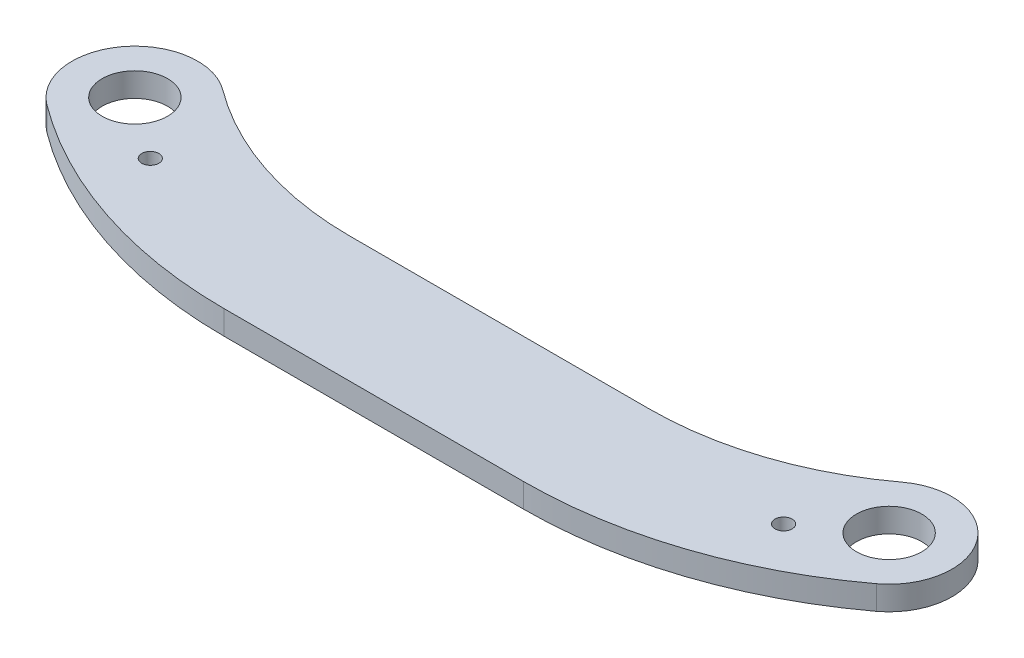
ISO-10303-21;
HEADER;
FILE_DESCRIPTION(('STEP AP214'),'2;1');
FILE_NAME('part.step','',(''),(''),'','','');
FILE_SCHEMA(('AUTOMOTIVE_DESIGN { 1 0 10303 214 1 1 1 1 }'));
ENDSEC;
DATA;
#1=APPLICATION_CONTEXT('core data for automotive mechanical design processes');
#2=APPLICATION_PROTOCOL_DEFINITION('international standard','automotive_design',2000,#1);
#3=PRODUCT_CONTEXT('',#1,'mechanical');
#4=PRODUCT('Part','Part','',(#3));
#5=PRODUCT_RELATED_PRODUCT_CATEGORY('part','',(#4));
#6=PRODUCT_DEFINITION_FORMATION('','',#4);
#7=PRODUCT_DEFINITION_CONTEXT('part definition',#1,'design');
#8=PRODUCT_DEFINITION('design','',#6,#7);
#9=PRODUCT_DEFINITION_SHAPE('','',#8);
#10=(LENGTH_UNIT() NAMED_UNIT(*) SI_UNIT(.MILLI.,.METRE.));
#11=(NAMED_UNIT(*) PLANE_ANGLE_UNIT() SI_UNIT($,.RADIAN.));
#12=(NAMED_UNIT(*) SI_UNIT($,.STERADIAN.) SOLID_ANGLE_UNIT());
#13=UNCERTAINTY_MEASURE_WITH_UNIT(LENGTH_MEASURE(1.E-05),#10,'distance_accuracy_value','');
#14=(GEOMETRIC_REPRESENTATION_CONTEXT(3) GLOBAL_UNCERTAINTY_ASSIGNED_CONTEXT((#13)) GLOBAL_UNIT_ASSIGNED_CONTEXT((#10,
#11,#12)) REPRESENTATION_CONTEXT('',''));
#15=CARTESIAN_POINT('',(0.,0.,0.));
#16=DIRECTION('',(0.,0.,1.));
#17=DIRECTION('',(1.,0.,0.));
#18=AXIS2_PLACEMENT_3D('',#15,#16,#17);
#19=CARTESIAN_POINT('',(-59.5,-9.53,-121.504166666667));
#20=DIRECTION('',(0.,1.,0.));
#21=DIRECTION('',(0.,0.,1.));
#22=AXIS2_PLACEMENT_3D('',#19,#20,#21);
#23=CYLINDRICAL_SURFACE('',#22,126.504166666667);
#24=CARTESIAN_POINT('',(-59.5,0.,-121.504166666667));
#25=DIRECTION('',(0.,-1.,0.));
#26=DIRECTION('',(0.,0.,-1.));
#27=AXIS2_PLACEMENT_3D('',#24,#25,#26);
#28=CIRCLE('',#27,126.504166666667);
#29=CARTESIAN_POINT('',(-59.5,0.,5.));
#30=VERTEX_POINT('',#29);
#31=CARTESIAN_POINT('',(-135.066417315255,0.,-20.0496410989797));
#32=VERTEX_POINT('',#31);
#33=EDGE_CURVE('E138',#30,#32,#28,.T.);
#34=ORIENTED_EDGE('',*,*,#33,.F.);
#35=DIRECTION('',(0.,1.,0.));
#36=VECTOR('',#35,1.);
#37=CARTESIAN_POINT('',(-59.5,-9.53,5.));
#38=LINE('',#37,#36);
#39=CARTESIAN_POINT('',(-59.5,-9.53,5.));
#40=VERTEX_POINT('',#39);
#41=EDGE_CURVE('E11',#40,#30,#38,.T.);
#42=ORIENTED_EDGE('',*,*,#41,.F.);
#43=CARTESIAN_POINT('',(-59.5,-9.53,-121.504166666667));
#44=DIRECTION('',(0.,-1.,0.));
#45=DIRECTION('',(0.,0.,-1.));
#46=AXIS2_PLACEMENT_3D('',#43,#44,#45);
#47=CIRCLE('',#46,126.504166666667);
#48=CARTESIAN_POINT('',(-135.066417315255,-9.53,-20.0496410989797));
#49=VERTEX_POINT('',#48);
#50=EDGE_CURVE('E159',#40,#49,#47,.T.);
#51=ORIENTED_EDGE('',*,*,#50,.T.);
#52=DIRECTION('',(0.,1.,0.));
#53=VECTOR('',#52,1.);
#54=CARTESIAN_POINT('',(-135.066417315255,-9.53,-20.0496410989797));
#55=LINE('',#54,#53);
#56=EDGE_CURVE('E44',#49,#32,#55,.T.);
#57=ORIENTED_EDGE('',*,*,#56,.T.);
#58=EDGE_LOOP('',(#34,#42,#51,#57));
#59=FACE_BOUND('',#58,.T.);
#60=ADVANCED_FACE('F41',(#59),#23,.F.);
#61=CARTESIAN_POINT('',(-59.5,-9.53,5.));
#62=DIRECTION('',(0.,0.,-1.));
#63=DIRECTION('',(-1.,0.,0.));
#64=AXIS2_PLACEMENT_3D('',#61,#62,#63);
#65=PLANE('',#64);
#66=DIRECTION('',(-1.,0.,0.));
#67=VECTOR('',#66,1.);
#68=CARTESIAN_POINT('',(-59.5,0.,5.));
#69=LINE('',#68,#67);
#70=CARTESIAN_POINT('',(59.5,0.,4.99999999999999));
#71=VERTEX_POINT('',#70);
#72=EDGE_CURVE('E157',#71,#30,#69,.T.);
#73=ORIENTED_EDGE('',*,*,#72,.F.);
#74=DIRECTION('',(0.,1.,0.));
#75=VECTOR('',#74,1.);
#76=CARTESIAN_POINT('',(59.5,-9.53,4.99999999999999));
#77=LINE('',#76,#75);
#78=CARTESIAN_POINT('',(59.5,-9.53,4.99999999999999));
#79=VERTEX_POINT('',#78);
#80=EDGE_CURVE('E50',#79,#71,#77,.T.);
#81=ORIENTED_EDGE('',*,*,#80,.F.);
#82=DIRECTION('',(-1.,0.,0.));
#83=VECTOR('',#82,1.);
#84=CARTESIAN_POINT('',(-59.5,-9.53,5.));
#85=LINE('',#84,#83);
#86=EDGE_CURVE('E128',#79,#40,#85,.T.);
#87=ORIENTED_EDGE('',*,*,#86,.T.);
#88=ORIENTED_EDGE('',*,*,#41,.T.);
#89=EDGE_LOOP('',(#73,#81,#87,#88));
#90=FACE_BOUND('',#89,.T.);
#91=ADVANCED_FACE('F171',(#90),#65,.T.);
#92=CARTESIAN_POINT('',(59.4999999999999,-9.53,-121.504166666667));
#93=DIRECTION('',(0.,1.,0.));
#94=DIRECTION('',(0.,0.,1.));
#95=AXIS2_PLACEMENT_3D('',#92,#93,#94);
#96=CYLINDRICAL_SURFACE('',#95,126.504166666667);
#97=CARTESIAN_POINT('',(59.4999999999999,0.,-121.504166666667));
#98=DIRECTION('',(0.,-1.,0.));
#99=DIRECTION('',(0.,0.,1.));
#100=AXIS2_PLACEMENT_3D('',#97,#98,#99);
#101=CIRCLE('',#100,126.504166666667);
#102=CARTESIAN_POINT('',(135.066417315255,0.,-20.0496410989797));
#103=VERTEX_POINT('',#102);
#104=EDGE_CURVE('E115',#103,#71,#101,.T.);
#105=ORIENTED_EDGE('',*,*,#104,.F.);
#106=DIRECTION('',(0.,1.,0.));
#107=VECTOR('',#106,1.);
#108=CARTESIAN_POINT('',(135.066417315255,-9.53,-20.0496410989797));
#109=LINE('',#108,#107);
#110=CARTESIAN_POINT('',(135.066417315255,-9.53,-20.0496410989797));
#111=VERTEX_POINT('',#110);
#112=EDGE_CURVE('E110',#111,#103,#109,.T.);
#113=ORIENTED_EDGE('',*,*,#112,.F.);
#114=CARTESIAN_POINT('',(59.4999999999999,-9.53,-121.504166666667));
#115=DIRECTION('',(0.,-1.,0.));
#116=DIRECTION('',(0.,0.,1.));
#117=AXIS2_PLACEMENT_3D('',#114,#115,#116);
#118=CIRCLE('',#117,126.504166666667);
#119=EDGE_CURVE('E113',#111,#79,#118,.T.);
#120=ORIENTED_EDGE('',*,*,#119,.T.);
#121=ORIENTED_EDGE('',*,*,#80,.T.);
#122=EDGE_LOOP('',(#105,#113,#120,#121));
#123=FACE_BOUND('',#122,.T.);
#124=ADVANCED_FACE('F112',(#123),#96,.F.);
#125=CARTESIAN_POINT('',(150.,-9.53,0.));
#126=DIRECTION('',(0.,1.,0.));
#127=DIRECTION('',(0.,0.,1.));
#128=AXIS2_PLACEMENT_3D('',#125,#126,#127);
#129=CYLINDRICAL_SURFACE('',#128,25.);
#130=CARTESIAN_POINT('',(150.,0.,0.));
#131=DIRECTION('',(0.,1.,0.));
#132=DIRECTION('',(0.,0.,1.));
#133=AXIS2_PLACEMENT_3D('',#130,#131,#132);
#134=CIRCLE('',#133,25.);
#135=CARTESIAN_POINT('',(164.933582684745,0.,20.0496410989797));
#136=VERTEX_POINT('',#135);
#137=EDGE_CURVE('E154',#136,#103,#134,.T.);
#138=ORIENTED_EDGE('',*,*,#137,.F.);
#139=DIRECTION('',(0.,1.,0.));
#140=VECTOR('',#139,1.);
#141=CARTESIAN_POINT('',(164.933582684745,-9.53,20.0496410989797));
#142=LINE('',#141,#140);
#143=CARTESIAN_POINT('',(164.933582684745,-9.53,20.0496410989797));
#144=VERTEX_POINT('',#143);
#145=EDGE_CURVE('E120',#144,#136,#142,.T.);
#146=ORIENTED_EDGE('',*,*,#145,.F.);
#147=CARTESIAN_POINT('',(150.,-9.53,0.));
#148=DIRECTION('',(0.,1.,0.));
#149=DIRECTION('',(0.,0.,1.));
#150=AXIS2_PLACEMENT_3D('',#147,#148,#149);
#151=CIRCLE('',#150,25.);
#152=EDGE_CURVE('E126',#144,#111,#151,.T.);
#153=ORIENTED_EDGE('',*,*,#152,.T.);
#154=ORIENTED_EDGE('',*,*,#112,.T.);
#155=EDGE_LOOP('',(#138,#146,#153,#154));
#156=FACE_BOUND('',#155,.T.);
#157=ADVANCED_FACE('F130',(#156),#129,.T.);
#158=CARTESIAN_POINT('',(59.4999999999999,-9.53,-121.504166666667));
#159=DIRECTION('',(0.,1.,0.));
#160=DIRECTION('',(0.,0.,1.));
#161=AXIS2_PLACEMENT_3D('',#158,#159,#160);
#162=CYLINDRICAL_SURFACE('',#161,176.504166666667);
#163=CARTESIAN_POINT('',(59.4999999999999,0.,-121.504166666667));
#164=DIRECTION('',(0.,1.,0.));
#165=DIRECTION('',(0.,0.,-1.));
#166=AXIS2_PLACEMENT_3D('',#163,#164,#165);
#167=CIRCLE('',#166,176.504166666667);
#168=CARTESIAN_POINT('',(59.5,0.,55.));
#169=VERTEX_POINT('',#168);
#170=EDGE_CURVE('E151',#169,#136,#167,.T.);
#171=ORIENTED_EDGE('',*,*,#170,.F.);
#172=DIRECTION('',(0.,1.,0.));
#173=VECTOR('',#172,1.);
#174=CARTESIAN_POINT('',(59.5,-9.53,55.));
#175=LINE('',#174,#173);
#176=CARTESIAN_POINT('',(59.5,-9.53,55.));
#177=VERTEX_POINT('',#176);
#178=EDGE_CURVE('E163',#177,#169,#175,.T.);
#179=ORIENTED_EDGE('',*,*,#178,.F.);
#180=CARTESIAN_POINT('',(59.4999999999999,-9.53,-121.504166666667));
#181=DIRECTION('',(0.,1.,0.));
#182=DIRECTION('',(0.,0.,-1.));
#183=AXIS2_PLACEMENT_3D('',#180,#181,#182);
#184=CIRCLE('',#183,176.504166666667);
#185=EDGE_CURVE('E131',#177,#144,#184,.T.);
#186=ORIENTED_EDGE('',*,*,#185,.T.);
#187=ORIENTED_EDGE('',*,*,#145,.T.);
#188=EDGE_LOOP('',(#171,#179,#186,#187));
#189=FACE_BOUND('',#188,.T.);
#190=ADVANCED_FACE('F184',(#189),#162,.T.);
#191=CARTESIAN_POINT('',(-59.5,-9.53,55.));
#192=DIRECTION('',(0.,0.,1.));
#193=DIRECTION('',(1.,0.,0.));
#194=AXIS2_PLACEMENT_3D('',#191,#192,#193);
#195=PLANE('',#194);
#196=DIRECTION('',(1.,0.,0.));
#197=VECTOR('',#196,1.);
#198=CARTESIAN_POINT('',(-59.5,0.,55.));
#199=LINE('',#198,#197);
#200=CARTESIAN_POINT('',(-59.5,0.,55.));
#201=VERTEX_POINT('',#200);
#202=EDGE_CURVE('E148',#201,#169,#199,.T.);
#203=ORIENTED_EDGE('',*,*,#202,.F.);
#204=DIRECTION('',(0.,1.,0.));
#205=VECTOR('',#204,1.);
#206=CARTESIAN_POINT('',(-59.5,-9.53,55.));
#207=LINE('',#206,#205);
#208=CARTESIAN_POINT('',(-59.5,-9.53,55.));
#209=VERTEX_POINT('',#208);
#210=EDGE_CURVE('E165',#209,#201,#207,.T.);
#211=ORIENTED_EDGE('',*,*,#210,.F.);
#212=DIRECTION('',(1.,0.,0.));
#213=VECTOR('',#212,1.);
#214=CARTESIAN_POINT('',(-59.5,-9.53,55.));
#215=LINE('',#214,#213);
#216=EDGE_CURVE('E133',#209,#177,#215,.T.);
#217=ORIENTED_EDGE('',*,*,#216,.T.);
#218=ORIENTED_EDGE('',*,*,#178,.T.);
#219=EDGE_LOOP('',(#203,#211,#217,#218));
#220=FACE_BOUND('',#219,.T.);
#221=ADVANCED_FACE('F187',(#220),#195,.T.);
#222=CARTESIAN_POINT('',(-59.5,-9.53,-121.504166666667));
#223=DIRECTION('',(0.,1.,0.));
#224=DIRECTION('',(0.,0.,1.));
#225=AXIS2_PLACEMENT_3D('',#222,#223,#224);
#226=CYLINDRICAL_SURFACE('',#225,176.504166666667);
#227=CARTESIAN_POINT('',(-59.5,0.,-121.504166666667));
#228=DIRECTION('',(0.,1.,0.));
#229=DIRECTION('',(0.,0.,-1.));
#230=AXIS2_PLACEMENT_3D('',#227,#228,#229);
#231=CIRCLE('',#230,176.504166666667);
#232=CARTESIAN_POINT('',(-164.933582684745,0.,20.0496410989797));
#233=VERTEX_POINT('',#232);
#234=EDGE_CURVE('E145',#233,#201,#231,.T.);
#235=ORIENTED_EDGE('',*,*,#234,.F.);
#236=DIRECTION('',(0.,1.,0.));
#237=VECTOR('',#236,1.);
#238=CARTESIAN_POINT('',(-164.933582684745,-9.53,20.0496410989797));
#239=LINE('',#238,#237);
#240=CARTESIAN_POINT('',(-164.933582684745,-9.53,20.0496410989797));
#241=VERTEX_POINT('',#240);
#242=EDGE_CURVE('E166',#241,#233,#239,.T.);
#243=ORIENTED_EDGE('',*,*,#242,.F.);
#244=CARTESIAN_POINT('',(-59.5,-9.53,-121.504166666667));
#245=DIRECTION('',(0.,1.,0.));
#246=DIRECTION('',(0.,0.,-1.));
#247=AXIS2_PLACEMENT_3D('',#244,#245,#246);
#248=CIRCLE('',#247,176.504166666667);
#249=EDGE_CURVE('E253',#241,#209,#248,.T.);
#250=ORIENTED_EDGE('',*,*,#249,.T.);
#251=ORIENTED_EDGE('',*,*,#210,.T.);
#252=EDGE_LOOP('',(#235,#243,#250,#251));
#253=FACE_BOUND('',#252,.T.);
#254=ADVANCED_FACE('F191',(#253),#226,.T.);
#255=CARTESIAN_POINT('',(-150.,-9.53,0.));
#256=DIRECTION('',(0.,1.,0.));
#257=DIRECTION('',(0.,0.,1.));
#258=AXIS2_PLACEMENT_3D('',#255,#256,#257);
#259=CYLINDRICAL_SURFACE('',#258,25.);
#260=CARTESIAN_POINT('',(-150.,0.,0.));
#261=DIRECTION('',(0.,1.,0.));
#262=DIRECTION('',(0.,0.,1.));
#263=AXIS2_PLACEMENT_3D('',#260,#261,#262);
#264=CIRCLE('',#263,25.);
#265=EDGE_CURVE('E141',#32,#233,#264,.T.);
#266=ORIENTED_EDGE('',*,*,#265,.F.);
#267=ORIENTED_EDGE('',*,*,#56,.F.);
#268=CARTESIAN_POINT('',(-150.,-9.53,0.));
#269=DIRECTION('',(0.,1.,0.));
#270=DIRECTION('',(0.,0.,1.));
#271=AXIS2_PLACEMENT_3D('',#268,#269,#270);
#272=CIRCLE('',#271,25.);
#273=EDGE_CURVE('E251',#49,#241,#272,.T.);
#274=ORIENTED_EDGE('',*,*,#273,.T.);
#275=ORIENTED_EDGE('',*,*,#242,.T.);
#276=EDGE_LOOP('',(#266,#267,#274,#275));
#277=FACE_BOUND('',#276,.T.);
#278=ADVANCED_FACE('F168',(#277),#259,.T.);
#279=CARTESIAN_POINT('',(-59.5,-9.53,-121.504166666667));
#280=DIRECTION('',(0.,-1.,0.));
#281=DIRECTION('',(0.,0.,-1.));
#282=AXIS2_PLACEMENT_3D('',#279,#280,#281);
#283=PLANE('',#282);
#284=CARTESIAN_POINT('',(-125.94,-9.53,17.92));
#285=DIRECTION('',(0.,1.,0.));
#286=DIRECTION('',(0.,0.,1.));
#287=AXIS2_PLACEMENT_3D('',#284,#285,#286);
#288=CIRCLE('',#287,3.4);
#289=CARTESIAN_POINT('',(-125.94,-9.53,21.32));
#290=VERTEX_POINT('',#289);
#291=EDGE_CURVE('E226',#290,#290,#288,.T.);
#292=ORIENTED_EDGE('',*,*,#291,.T.);
#293=EDGE_LOOP('',(#292));
#294=FACE_BOUND('',#293,.T.);
#295=CARTESIAN_POINT('',(125.94,-9.53,17.92));
#296=DIRECTION('',(0.,1.,0.));
#297=DIRECTION('',(0.,0.,1.));
#298=AXIS2_PLACEMENT_3D('',#295,#296,#297);
#299=CIRCLE('',#298,3.4);
#300=CARTESIAN_POINT('',(125.94,-9.53,21.32));
#301=VERTEX_POINT('',#300);
#302=EDGE_CURVE('E234',#301,#301,#299,.T.);
#303=ORIENTED_EDGE('',*,*,#302,.T.);
#304=EDGE_LOOP('',(#303));
#305=FACE_BOUND('',#304,.T.);
#306=CARTESIAN_POINT('',(150.,-9.53,0.));
#307=DIRECTION('',(0.,1.,0.));
#308=DIRECTION('',(0.,0.,1.));
#309=AXIS2_PLACEMENT_3D('',#306,#307,#308);
#310=CIRCLE('',#309,13.);
#311=CARTESIAN_POINT('',(150.,-9.53,13.));
#312=VERTEX_POINT('',#311);
#313=EDGE_CURVE('E240',#312,#312,#310,.T.);
#314=ORIENTED_EDGE('',*,*,#313,.T.);
#315=EDGE_LOOP('',(#314));
#316=FACE_BOUND('',#315,.T.);
#317=CARTESIAN_POINT('',(-150.,-9.53,0.));
#318=DIRECTION('',(0.,1.,0.));
#319=DIRECTION('',(0.,0.,1.));
#320=AXIS2_PLACEMENT_3D('',#317,#318,#319);
#321=CIRCLE('',#320,12.9999999999999);
#322=CARTESIAN_POINT('',(-150.,-9.53,12.9999999999999));
#323=VERTEX_POINT('',#322);
#324=EDGE_CURVE('E142',#323,#323,#321,.T.);
#325=ORIENTED_EDGE('',*,*,#324,.T.);
#326=EDGE_LOOP('',(#325));
#327=FACE_BOUND('',#326,.T.);
#328=ORIENTED_EDGE('',*,*,#50,.F.);
#329=ORIENTED_EDGE('',*,*,#86,.F.);
#330=ORIENTED_EDGE('',*,*,#119,.F.);
#331=ORIENTED_EDGE('',*,*,#152,.F.);
#332=ORIENTED_EDGE('',*,*,#185,.F.);
#333=ORIENTED_EDGE('',*,*,#216,.F.);
#334=ORIENTED_EDGE('',*,*,#249,.F.);
#335=ORIENTED_EDGE('',*,*,#273,.F.);
#336=EDGE_LOOP('',(#328,#329,#330,#331,#332,#333,#334,#335));
#337=FACE_BOUND('',#336,.T.);
#338=ADVANCED_FACE('F124',(#294,#305,#316,#327,#337),#283,.T.);
#339=CARTESIAN_POINT('',(-59.5,0.,-121.504166666667));
#340=DIRECTION('',(0.,-1.,0.));
#341=DIRECTION('',(0.,0.,-1.));
#342=AXIS2_PLACEMENT_3D('',#339,#340,#341);
#343=PLANE('',#342);
#344=CARTESIAN_POINT('',(-125.94,0.,17.92));
#345=DIRECTION('',(0.,1.,0.));
#346=DIRECTION('',(0.,0.,1.));
#347=AXIS2_PLACEMENT_3D('',#344,#345,#346);
#348=CIRCLE('',#347,3.4);
#349=CARTESIAN_POINT('',(-125.94,0.,21.32));
#350=VERTEX_POINT('',#349);
#351=EDGE_CURVE('E229',#350,#350,#348,.T.);
#352=ORIENTED_EDGE('',*,*,#351,.F.);
#353=EDGE_LOOP('',(#352));
#354=FACE_BOUND('',#353,.T.);
#355=CARTESIAN_POINT('',(125.94,0.,17.92));
#356=DIRECTION('',(0.,1.,0.));
#357=DIRECTION('',(0.,0.,1.));
#358=AXIS2_PLACEMENT_3D('',#355,#356,#357);
#359=CIRCLE('',#358,3.4);
#360=CARTESIAN_POINT('',(125.94,0.,21.32));
#361=VERTEX_POINT('',#360);
#362=EDGE_CURVE('E231',#361,#361,#359,.T.);
#363=ORIENTED_EDGE('',*,*,#362,.F.);
#364=EDGE_LOOP('',(#363));
#365=FACE_BOUND('',#364,.T.);
#366=CARTESIAN_POINT('',(150.,0.,0.));
#367=DIRECTION('',(0.,1.,0.));
#368=DIRECTION('',(0.,0.,1.));
#369=AXIS2_PLACEMENT_3D('',#366,#367,#368);
#370=CIRCLE('',#369,13.);
#371=CARTESIAN_POINT('',(150.,0.,13.));
#372=VERTEX_POINT('',#371);
#373=EDGE_CURVE('E237',#372,#372,#370,.T.);
#374=ORIENTED_EDGE('',*,*,#373,.F.);
#375=EDGE_LOOP('',(#374));
#376=FACE_BOUND('',#375,.T.);
#377=CARTESIAN_POINT('',(-150.,0.,0.));
#378=DIRECTION('',(0.,1.,0.));
#379=DIRECTION('',(0.,0.,1.));
#380=AXIS2_PLACEMENT_3D('',#377,#378,#379);
#381=CIRCLE('',#380,12.9999999999999);
#382=CARTESIAN_POINT('',(-150.,0.,12.9999999999999));
#383=VERTEX_POINT('',#382);
#384=EDGE_CURVE('E243',#383,#383,#381,.T.);
#385=ORIENTED_EDGE('',*,*,#384,.F.);
#386=EDGE_LOOP('',(#385));
#387=FACE_BOUND('',#386,.T.);
#388=ORIENTED_EDGE('',*,*,#33,.T.);
#389=ORIENTED_EDGE('',*,*,#265,.T.);
#390=ORIENTED_EDGE('',*,*,#234,.T.);
#391=ORIENTED_EDGE('',*,*,#202,.T.);
#392=ORIENTED_EDGE('',*,*,#170,.T.);
#393=ORIENTED_EDGE('',*,*,#137,.T.);
#394=ORIENTED_EDGE('',*,*,#104,.T.);
#395=ORIENTED_EDGE('',*,*,#72,.T.);
#396=EDGE_LOOP('',(#388,#389,#390,#391,#392,#393,#394,#395));
#397=FACE_BOUND('',#396,.T.);
#398=ADVANCED_FACE('F170',(#354,#365,#376,#387,#397),#343,.F.);
#399=CARTESIAN_POINT('',(-150.,-9.53,0.));
#400=DIRECTION('',(0.,1.,0.));
#401=DIRECTION('',(0.,0.,1.));
#402=AXIS2_PLACEMENT_3D('',#399,#400,#401);
#403=CYLINDRICAL_SURFACE('',#402,12.9999999999999);
#404=ORIENTED_EDGE('',*,*,#324,.F.);
#405=EDGE_LOOP('',(#404));
#406=FACE_BOUND('',#405,.T.);
#407=ORIENTED_EDGE('',*,*,#384,.T.);
#408=EDGE_LOOP('',(#407));
#409=FACE_BOUND('',#408,.T.);
#410=ADVANCED_FACE('F203',(#406,#409),#403,.F.);
#411=CARTESIAN_POINT('',(150.,-9.53,0.));
#412=DIRECTION('',(0.,1.,0.));
#413=DIRECTION('',(0.,0.,1.));
#414=AXIS2_PLACEMENT_3D('',#411,#412,#413);
#415=CYLINDRICAL_SURFACE('',#414,13.);
#416=ORIENTED_EDGE('',*,*,#313,.F.);
#417=EDGE_LOOP('',(#416));
#418=FACE_BOUND('',#417,.T.);
#419=ORIENTED_EDGE('',*,*,#373,.T.);
#420=EDGE_LOOP('',(#419));
#421=FACE_BOUND('',#420,.T.);
#422=ADVANCED_FACE('F210',(#418,#421),#415,.F.);
#423=CARTESIAN_POINT('',(125.94,-9.53,17.92));
#424=DIRECTION('',(0.,1.,0.));
#425=DIRECTION('',(0.,0.,1.));
#426=AXIS2_PLACEMENT_3D('',#423,#424,#425);
#427=CYLINDRICAL_SURFACE('',#426,3.4);
#428=ORIENTED_EDGE('',*,*,#302,.F.);
#429=EDGE_LOOP('',(#428));
#430=FACE_BOUND('',#429,.T.);
#431=ORIENTED_EDGE('',*,*,#362,.T.);
#432=EDGE_LOOP('',(#431));
#433=FACE_BOUND('',#432,.T.);
#434=ADVANCED_FACE('F214',(#430,#433),#427,.F.);
#435=CARTESIAN_POINT('',(-125.94,-9.53,17.92));
#436=DIRECTION('',(0.,1.,0.));
#437=DIRECTION('',(0.,0.,1.));
#438=AXIS2_PLACEMENT_3D('',#435,#436,#437);
#439=CYLINDRICAL_SURFACE('',#438,3.4);
#440=ORIENTED_EDGE('',*,*,#291,.F.);
#441=EDGE_LOOP('',(#440));
#442=FACE_BOUND('',#441,.T.);
#443=ORIENTED_EDGE('',*,*,#351,.T.);
#444=EDGE_LOOP('',(#443));
#445=FACE_BOUND('',#444,.T.);
#446=ADVANCED_FACE('F218',(#442,#445),#439,.F.);
#447=CLOSED_SHELL('',(#60,#91,#124,#157,#190,#221,#254,#278,#338,#398,#410,#422,#434,#446));
#448=MANIFOLD_SOLID_BREP('B2',#447);
#449=ADVANCED_BREP_SHAPE_REPRESENTATION('',(#18,#448),#14);
#450=SHAPE_DEFINITION_REPRESENTATION(#9,#449);
ENDSEC;
END-ISO-10303-21;
